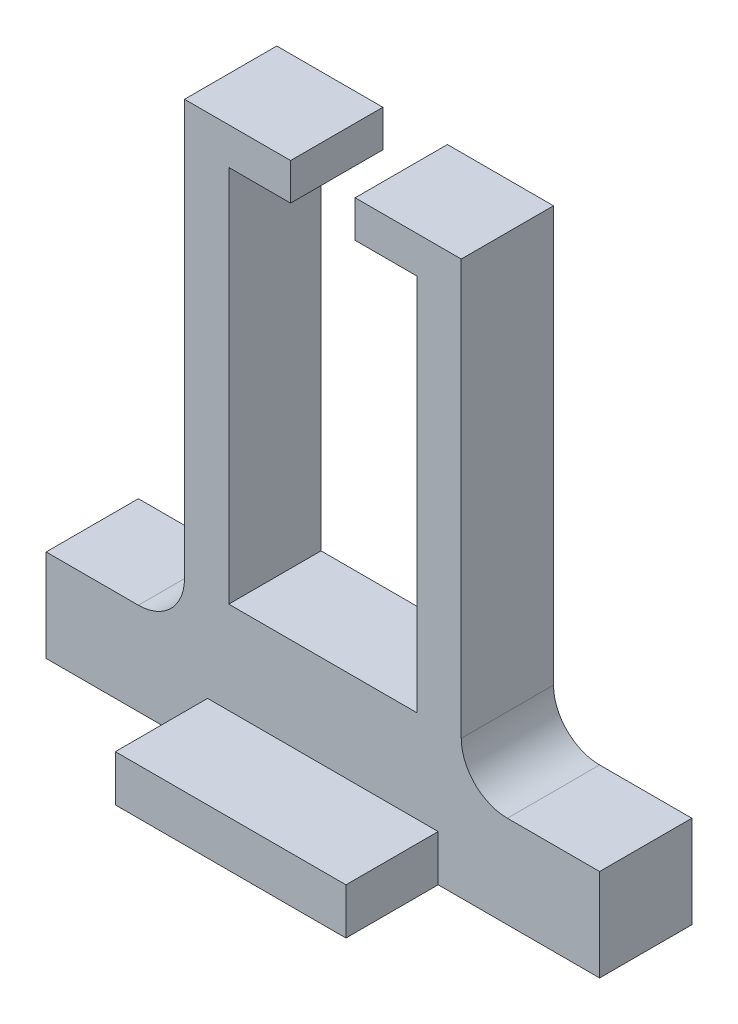
ISO-10303-21;
HEADER;
FILE_DESCRIPTION(('STEP AP214'),'2;1');
FILE_NAME('part.step','',(''),(''),'','','');
FILE_SCHEMA(('AUTOMOTIVE_DESIGN { 1 0 10303 214 1 1 1 1 }'));
ENDSEC;
DATA;
#1=APPLICATION_CONTEXT('core data for automotive mechanical design processes');
#2=APPLICATION_PROTOCOL_DEFINITION('international standard','automotive_design',2000,#1);
#3=PRODUCT_CONTEXT('',#1,'mechanical');
#4=PRODUCT('Part','Part','',(#3));
#5=PRODUCT_RELATED_PRODUCT_CATEGORY('part','',(#4));
#6=PRODUCT_DEFINITION_FORMATION('','',#4);
#7=PRODUCT_DEFINITION_CONTEXT('part definition',#1,'design');
#8=PRODUCT_DEFINITION('design','',#6,#7);
#9=PRODUCT_DEFINITION_SHAPE('','',#8);
#10=(LENGTH_UNIT() NAMED_UNIT(*) SI_UNIT(.MILLI.,.METRE.));
#11=(NAMED_UNIT(*) PLANE_ANGLE_UNIT() SI_UNIT($,.RADIAN.));
#12=(NAMED_UNIT(*) SI_UNIT($,.STERADIAN.) SOLID_ANGLE_UNIT());
#13=UNCERTAINTY_MEASURE_WITH_UNIT(LENGTH_MEASURE(1.E-05),#10,'distance_accuracy_value','');
#14=(GEOMETRIC_REPRESENTATION_CONTEXT(3) GLOBAL_UNCERTAINTY_ASSIGNED_CONTEXT((#13)) GLOBAL_UNIT_ASSIGNED_CONTEXT((#10,
#11,#12)) REPRESENTATION_CONTEXT('',''));
#15=CARTESIAN_POINT('',(0.,0.,0.));
#16=DIRECTION('',(0.,0.,1.));
#17=DIRECTION('',(1.,0.,0.));
#18=AXIS2_PLACEMENT_3D('',#15,#16,#17);
#19=CARTESIAN_POINT('',(20.,-20.5,10.));
#20=DIRECTION('',(0.,0.,-1.));
#21=DIRECTION('',(-1.,0.,0.));
#22=AXIS2_PLACEMENT_3D('',#19,#20,#21);
#23=PLANE('',#22);
#24=DIRECTION('',(0.,-1.,0.));
#25=VECTOR('',#24,1.);
#26=CARTESIAN_POINT('',(-12.5,-35.5,10.));
#27=LINE('',#26,#25);
#28=CARTESIAN_POINT('',(-12.5,-30.5,10.));
#29=VERTEX_POINT('',#28);
#30=CARTESIAN_POINT('',(-12.5,-35.5,10.));
#31=VERTEX_POINT('',#30);
#32=EDGE_CURVE('E52',#29,#31,#27,.T.);
#33=ORIENTED_EDGE('',*,*,#32,.F.);
#34=DIRECTION('',(-1.,0.,0.));
#35=VECTOR('',#34,1.);
#36=CARTESIAN_POINT('',(-12.5,-30.5,10.));
#37=LINE('',#36,#35);
#38=CARTESIAN_POINT('',(12.5,-30.5,10.));
#39=VERTEX_POINT('',#38);
#40=EDGE_CURVE('E205',#39,#29,#37,.T.);
#41=ORIENTED_EDGE('',*,*,#40,.F.);
#42=DIRECTION('',(0.,1.,0.));
#43=VECTOR('',#42,1.);
#44=CARTESIAN_POINT('',(12.5,-35.5,10.));
#45=LINE('',#44,#43);
#46=CARTESIAN_POINT('',(12.5,-35.5,10.));
#47=VERTEX_POINT('',#46);
#48=EDGE_CURVE('E58',#47,#39,#45,.T.);
#49=ORIENTED_EDGE('',*,*,#48,.F.);
#50=DIRECTION('',(1.,0.,0.));
#51=VECTOR('',#50,1.);
#52=CARTESIAN_POINT('',(30.,-35.5,10.));
#53=LINE('',#52,#51);
#54=CARTESIAN_POINT('',(30.,-35.5,10.));
#55=VERTEX_POINT('',#54);
#56=EDGE_CURVE('E281',#47,#55,#53,.T.);
#57=ORIENTED_EDGE('',*,*,#56,.T.);
#58=DIRECTION('',(0.,1.,0.));
#59=VECTOR('',#58,1.);
#60=CARTESIAN_POINT('',(30.,-25.5,10.));
#61=LINE('',#60,#59);
#62=CARTESIAN_POINT('',(30.,-25.5,10.));
#63=VERTEX_POINT('',#62);
#64=EDGE_CURVE('E284',#55,#63,#61,.T.);
#65=ORIENTED_EDGE('',*,*,#64,.T.);
#66=DIRECTION('',(-1.,0.,0.));
#67=VECTOR('',#66,1.);
#68=CARTESIAN_POINT('',(20.,-25.5,10.));
#69=LINE('',#68,#67);
#70=CARTESIAN_POINT('',(20.,-25.5,10.));
#71=VERTEX_POINT('',#70);
#72=EDGE_CURVE('E286',#63,#71,#69,.T.);
#73=ORIENTED_EDGE('',*,*,#72,.T.);
#74=CARTESIAN_POINT('',(20.,-20.5,10.));
#75=DIRECTION('',(0.,0.,-1.));
#76=DIRECTION('',(-1.,0.,0.));
#77=AXIS2_PLACEMENT_3D('',#74,#75,#76);
#78=CIRCLE('',#77,5.);
#79=CARTESIAN_POINT('',(15.,-20.5,10.));
#80=VERTEX_POINT('',#79);
#81=EDGE_CURVE('E288',#71,#80,#78,.T.);
#82=ORIENTED_EDGE('',*,*,#81,.T.);
#83=DIRECTION('',(0.,1.,0.));
#84=VECTOR('',#83,1.);
#85=CARTESIAN_POINT('',(15.,24.5,10.));
#86=LINE('',#85,#84);
#87=CARTESIAN_POINT('',(15.,24.5,10.));
#88=VERTEX_POINT('',#87);
#89=EDGE_CURVE('E290',#80,#88,#86,.T.);
#90=ORIENTED_EDGE('',*,*,#89,.T.);
#91=DIRECTION('',(-1.,0.,0.));
#92=VECTOR('',#91,1.);
#93=CARTESIAN_POINT('',(-15.,24.5,10.));
#94=LINE('',#93,#92);
#95=CARTESIAN_POINT('',(3.5,24.5,10.));
#96=VERTEX_POINT('',#95);
#97=EDGE_CURVE('E269',#88,#96,#94,.T.);
#98=ORIENTED_EDGE('',*,*,#97,.T.);
#99=DIRECTION('',(0.,1.,0.));
#100=VECTOR('',#99,1.);
#101=CARTESIAN_POINT('',(3.5,-35.501,10.));
#102=LINE('',#101,#100);
#103=CARTESIAN_POINT('',(3.5,20.5,10.));
#104=VERTEX_POINT('',#103);
#105=EDGE_CURVE('E220',#104,#96,#102,.T.);
#106=ORIENTED_EDGE('',*,*,#105,.F.);
#107=DIRECTION('',(-1.,0.,0.));
#108=VECTOR('',#107,1.);
#109=CARTESIAN_POINT('',(-10.2,20.5,10.));
#110=LINE('',#109,#108);
#111=CARTESIAN_POINT('',(10.2,20.5,10.));
#112=VERTEX_POINT('',#111);
#113=EDGE_CURVE('E238',#112,#104,#110,.T.);
#114=ORIENTED_EDGE('',*,*,#113,.F.);
#115=DIRECTION('',(0.,1.,0.));
#116=VECTOR('',#115,1.);
#117=CARTESIAN_POINT('',(10.2,20.5,10.));
#118=LINE('',#117,#116);
#119=CARTESIAN_POINT('',(10.2,-20.5,10.));
#120=VERTEX_POINT('',#119);
#121=EDGE_CURVE('E234',#120,#112,#118,.T.);
#122=ORIENTED_EDGE('',*,*,#121,.F.);
#123=DIRECTION('',(1.,0.,0.));
#124=VECTOR('',#123,1.);
#125=CARTESIAN_POINT('',(-10.2,-20.5,10.));
#126=LINE('',#125,#124);
#127=CARTESIAN_POINT('',(-10.2,-20.5,10.));
#128=VERTEX_POINT('',#127);
#129=EDGE_CURVE('E244',#128,#120,#126,.T.);
#130=ORIENTED_EDGE('',*,*,#129,.F.);
#131=DIRECTION('',(0.,-1.,0.));
#132=VECTOR('',#131,1.);
#133=CARTESIAN_POINT('',(-10.2,20.5,10.));
#134=LINE('',#133,#132);
#135=CARTESIAN_POINT('',(-10.2,20.5,10.));
#136=VERTEX_POINT('',#135);
#137=EDGE_CURVE('E241',#136,#128,#134,.T.);
#138=ORIENTED_EDGE('',*,*,#137,.F.);
#139=CARTESIAN_POINT('',(-3.5,20.5,10.));
#140=VERTEX_POINT('',#139);
#141=EDGE_CURVE('E236',#140,#136,#110,.T.);
#142=ORIENTED_EDGE('',*,*,#141,.F.);
#143=DIRECTION('',(0.,1.,0.));
#144=VECTOR('',#143,1.);
#145=CARTESIAN_POINT('',(-3.5,-35.501,10.));
#146=LINE('',#145,#144);
#147=CARTESIAN_POINT('',(-3.5,24.5,10.));
#148=VERTEX_POINT('',#147);
#149=EDGE_CURVE('E219',#140,#148,#146,.T.);
#150=ORIENTED_EDGE('',*,*,#149,.T.);
#151=CARTESIAN_POINT('',(-15.,24.5,10.));
#152=VERTEX_POINT('',#151);
#153=EDGE_CURVE('E273',#148,#152,#94,.T.);
#154=ORIENTED_EDGE('',*,*,#153,.T.);
#155=DIRECTION('',(0.,-1.,0.));
#156=VECTOR('',#155,1.);
#157=CARTESIAN_POINT('',(-15.,24.5,10.));
#158=LINE('',#157,#156);
#159=CARTESIAN_POINT('',(-15.,-20.5,10.));
#160=VERTEX_POINT('',#159);
#161=EDGE_CURVE('E272',#152,#160,#158,.T.);
#162=ORIENTED_EDGE('',*,*,#161,.T.);
#163=CARTESIAN_POINT('',(-20.,-20.5,10.));
#164=DIRECTION('',(0.,0.,-1.));
#165=DIRECTION('',(-1.,0.,0.));
#166=AXIS2_PLACEMENT_3D('',#163,#164,#165);
#167=CIRCLE('',#166,5.);
#168=CARTESIAN_POINT('',(-20.,-25.5,10.));
#169=VERTEX_POINT('',#168);
#170=EDGE_CURVE('E275',#160,#169,#167,.T.);
#171=ORIENTED_EDGE('',*,*,#170,.T.);
#172=DIRECTION('',(-1.,0.,0.));
#173=VECTOR('',#172,1.);
#174=CARTESIAN_POINT('',(-30.,-25.5,10.));
#175=LINE('',#174,#173);
#176=CARTESIAN_POINT('',(-30.,-25.5,10.));
#177=VERTEX_POINT('',#176);
#178=EDGE_CURVE('E277',#169,#177,#175,.T.);
#179=ORIENTED_EDGE('',*,*,#178,.T.);
#180=DIRECTION('',(0.,-1.,0.));
#181=VECTOR('',#180,1.);
#182=CARTESIAN_POINT('',(-30.,-35.5,10.));
#183=LINE('',#182,#181);
#184=CARTESIAN_POINT('',(-30.,-35.5,10.));
#185=VERTEX_POINT('',#184);
#186=EDGE_CURVE('E279',#177,#185,#183,.T.);
#187=ORIENTED_EDGE('',*,*,#186,.T.);
#188=EDGE_CURVE('E282',#185,#31,#53,.T.);
#189=ORIENTED_EDGE('',*,*,#188,.T.);
#190=EDGE_LOOP('',(#33,#41,#49,#57,#65,#73,#82,#90,#98,#106,#114,#122,#130,#138,#142,#150,#154,
#162,#171,#179,#187,#189));
#191=FACE_BOUND('',#190,.T.);
#192=ADVANCED_FACE('F37',(#191),#23,.F.);
#193=CARTESIAN_POINT('',(-15.,24.5,10.));
#194=DIRECTION('',(0.,-1.,0.));
#195=DIRECTION('',(0.,0.,-1.));
#196=AXIS2_PLACEMENT_3D('',#193,#194,#195);
#197=PLANE('',#196);
#198=DIRECTION('',(-1.,0.,0.));
#199=VECTOR('',#198,1.);
#200=CARTESIAN_POINT('',(-15.,24.5,0.));
#201=LINE('',#200,#199);
#202=CARTESIAN_POINT('',(15.,24.5,0.));
#203=VERTEX_POINT('',#202);
#204=CARTESIAN_POINT('',(3.5,24.5,0.));
#205=VERTEX_POINT('',#204);
#206=EDGE_CURVE('E293',#203,#205,#201,.T.);
#207=ORIENTED_EDGE('',*,*,#206,.T.);
#208=DIRECTION('',(0.,0.,-1.));
#209=VECTOR('',#208,1.);
#210=CARTESIAN_POINT('',(3.5,24.5,10.));
#211=LINE('',#210,#209);
#212=EDGE_CURVE('E221',#96,#205,#211,.T.);
#213=ORIENTED_EDGE('',*,*,#212,.F.);
#214=ORIENTED_EDGE('',*,*,#97,.F.);
#215=DIRECTION('',(0.,0.,-1.));
#216=VECTOR('',#215,1.);
#217=CARTESIAN_POINT('',(15.,24.5,10.));
#218=LINE('',#217,#216);
#219=EDGE_CURVE('E292',#88,#203,#218,.T.);
#220=ORIENTED_EDGE('',*,*,#219,.T.);
#221=EDGE_LOOP('',(#207,#213,#214,#220));
#222=FACE_BOUND('',#221,.T.);
#223=ADVANCED_FACE('F394',(#222),#197,.F.);
#224=CARTESIAN_POINT('',(-10.2,20.5,10.));
#225=DIRECTION('',(0.,-1.,0.));
#226=DIRECTION('',(0.,0.,-1.));
#227=AXIS2_PLACEMENT_3D('',#224,#225,#226);
#228=PLANE('',#227);
#229=DIRECTION('',(0.,0.,-1.));
#230=VECTOR('',#229,1.);
#231=CARTESIAN_POINT('',(3.5,20.5,10.));
#232=LINE('',#231,#230);
#233=CARTESIAN_POINT('',(3.5,20.5,0.));
#234=VERTEX_POINT('',#233);
#235=EDGE_CURVE('E210',#104,#234,#232,.T.);
#236=ORIENTED_EDGE('',*,*,#235,.T.);
#237=DIRECTION('',(-1.,0.,0.));
#238=VECTOR('',#237,1.);
#239=CARTESIAN_POINT('',(-10.2,20.5,0.));
#240=LINE('',#239,#238);
#241=CARTESIAN_POINT('',(10.2,20.5,0.));
#242=VERTEX_POINT('',#241);
#243=EDGE_CURVE('E250',#242,#234,#240,.T.);
#244=ORIENTED_EDGE('',*,*,#243,.F.);
#245=DIRECTION('',(0.,0.,-1.));
#246=VECTOR('',#245,1.);
#247=CARTESIAN_POINT('',(10.2,20.5,10.));
#248=LINE('',#247,#246);
#249=EDGE_CURVE('E265',#112,#242,#248,.T.);
#250=ORIENTED_EDGE('',*,*,#249,.F.);
#251=ORIENTED_EDGE('',*,*,#113,.T.);
#252=EDGE_LOOP('',(#236,#244,#250,#251));
#253=FACE_BOUND('',#252,.T.);
#254=ADVANCED_FACE('F388',(#253),#228,.T.);
#255=CARTESIAN_POINT('',(20.,-20.5,0.));
#256=DIRECTION('',(0.,0.,-1.));
#257=DIRECTION('',(-1.,0.,0.));
#258=AXIS2_PLACEMENT_3D('',#255,#256,#257);
#259=PLANE('',#258);
#260=DIRECTION('',(0.,1.,0.));
#261=VECTOR('',#260,1.);
#262=CARTESIAN_POINT('',(3.5,-35.501,0.));
#263=LINE('',#262,#261);
#264=EDGE_CURVE('E228',#234,#205,#263,.T.);
#265=ORIENTED_EDGE('',*,*,#264,.T.);
#266=ORIENTED_EDGE('',*,*,#206,.F.);
#267=DIRECTION('',(0.,1.,0.));
#268=VECTOR('',#267,1.);
#269=CARTESIAN_POINT('',(15.,24.5,0.));
#270=LINE('',#269,#268);
#271=CARTESIAN_POINT('',(15.,-20.5,0.));
#272=VERTEX_POINT('',#271);
#273=EDGE_CURVE('E312',#272,#203,#270,.T.);
#274=ORIENTED_EDGE('',*,*,#273,.F.);
#275=CARTESIAN_POINT('',(20.,-20.5,0.));
#276=DIRECTION('',(0.,0.,-1.));
#277=DIRECTION('',(-1.,0.,0.));
#278=AXIS2_PLACEMENT_3D('',#275,#276,#277);
#279=CIRCLE('',#278,5.);
#280=CARTESIAN_POINT('',(20.,-25.5,0.));
#281=VERTEX_POINT('',#280);
#282=EDGE_CURVE('E310',#281,#272,#279,.T.);
#283=ORIENTED_EDGE('',*,*,#282,.F.);
#284=DIRECTION('',(-1.,0.,0.));
#285=VECTOR('',#284,1.);
#286=CARTESIAN_POINT('',(20.,-25.5,0.));
#287=LINE('',#286,#285);
#288=CARTESIAN_POINT('',(30.,-25.5,0.));
#289=VERTEX_POINT('',#288);
#290=EDGE_CURVE('E308',#289,#281,#287,.T.);
#291=ORIENTED_EDGE('',*,*,#290,.F.);
#292=DIRECTION('',(0.,1.,0.));
#293=VECTOR('',#292,1.);
#294=CARTESIAN_POINT('',(30.,-25.5,0.));
#295=LINE('',#294,#293);
#296=CARTESIAN_POINT('',(30.,-35.5,0.));
#297=VERTEX_POINT('',#296);
#298=EDGE_CURVE('E306',#297,#289,#295,.T.);
#299=ORIENTED_EDGE('',*,*,#298,.F.);
#300=DIRECTION('',(1.,0.,0.));
#301=VECTOR('',#300,1.);
#302=CARTESIAN_POINT('',(30.,-35.5,0.));
#303=LINE('',#302,#301);
#304=CARTESIAN_POINT('',(-30.,-35.5,0.));
#305=VERTEX_POINT('',#304);
#306=EDGE_CURVE('E304',#305,#297,#303,.T.);
#307=ORIENTED_EDGE('',*,*,#306,.F.);
#308=DIRECTION('',(0.,-1.,0.));
#309=VECTOR('',#308,1.);
#310=CARTESIAN_POINT('',(-30.,-35.5,0.));
#311=LINE('',#310,#309);
#312=CARTESIAN_POINT('',(-30.,-25.5,0.));
#313=VERTEX_POINT('',#312);
#314=EDGE_CURVE('E302',#313,#305,#311,.T.);
#315=ORIENTED_EDGE('',*,*,#314,.F.);
#316=DIRECTION('',(-1.,0.,0.));
#317=VECTOR('',#316,1.);
#318=CARTESIAN_POINT('',(-30.,-25.5,0.));
#319=LINE('',#318,#317);
#320=CARTESIAN_POINT('',(-20.,-25.5,0.));
#321=VERTEX_POINT('',#320);
#322=EDGE_CURVE('E300',#321,#313,#319,.T.);
#323=ORIENTED_EDGE('',*,*,#322,.F.);
#324=CARTESIAN_POINT('',(-20.,-20.5,0.));
#325=DIRECTION('',(0.,0.,-1.));
#326=DIRECTION('',(-1.,0.,0.));
#327=AXIS2_PLACEMENT_3D('',#324,#325,#326);
#328=CIRCLE('',#327,5.);
#329=CARTESIAN_POINT('',(-15.,-20.5,0.));
#330=VERTEX_POINT('',#329);
#331=EDGE_CURVE('E298',#330,#321,#328,.T.);
#332=ORIENTED_EDGE('',*,*,#331,.F.);
#333=DIRECTION('',(0.,-1.,0.));
#334=VECTOR('',#333,1.);
#335=CARTESIAN_POINT('',(-15.,24.5,0.));
#336=LINE('',#335,#334);
#337=CARTESIAN_POINT('',(-15.,24.5,0.));
#338=VERTEX_POINT('',#337);
#339=EDGE_CURVE('E296',#338,#330,#336,.T.);
#340=ORIENTED_EDGE('',*,*,#339,.F.);
#341=CARTESIAN_POINT('',(-3.5,24.5,0.));
#342=VERTEX_POINT('',#341);
#343=EDGE_CURVE('E268',#342,#338,#201,.T.);
#344=ORIENTED_EDGE('',*,*,#343,.F.);
#345=DIRECTION('',(0.,1.,0.));
#346=VECTOR('',#345,1.);
#347=CARTESIAN_POINT('',(-3.5,-35.501,0.));
#348=LINE('',#347,#346);
#349=CARTESIAN_POINT('',(-3.5,20.5,0.));
#350=VERTEX_POINT('',#349);
#351=EDGE_CURVE('E208',#350,#342,#348,.T.);
#352=ORIENTED_EDGE('',*,*,#351,.F.);
#353=CARTESIAN_POINT('',(-10.2,20.5,0.));
#354=VERTEX_POINT('',#353);
#355=EDGE_CURVE('E249',#350,#354,#240,.T.);
#356=ORIENTED_EDGE('',*,*,#355,.T.);
#357=DIRECTION('',(0.,-1.,0.));
#358=VECTOR('',#357,1.);
#359=CARTESIAN_POINT('',(-10.2,20.5,0.));
#360=LINE('',#359,#358);
#361=CARTESIAN_POINT('',(-10.2,-20.5,0.));
#362=VERTEX_POINT('',#361);
#363=EDGE_CURVE('E253',#354,#362,#360,.T.);
#364=ORIENTED_EDGE('',*,*,#363,.T.);
#365=DIRECTION('',(1.,0.,0.));
#366=VECTOR('',#365,1.);
#367=CARTESIAN_POINT('',(-10.2,-20.5,0.));
#368=LINE('',#367,#366);
#369=CARTESIAN_POINT('',(10.2,-20.5,0.));
#370=VERTEX_POINT('',#369);
#371=EDGE_CURVE('E237',#362,#370,#368,.T.);
#372=ORIENTED_EDGE('',*,*,#371,.T.);
#373=DIRECTION('',(0.,1.,0.));
#374=VECTOR('',#373,1.);
#375=CARTESIAN_POINT('',(10.2,20.5,0.));
#376=LINE('',#375,#374);
#377=EDGE_CURVE('E223',#370,#242,#376,.T.);
#378=ORIENTED_EDGE('',*,*,#377,.T.);
#379=ORIENTED_EDGE('',*,*,#243,.T.);
#380=EDGE_LOOP('',(#265,#266,#274,#283,#291,#299,#307,#315,#323,#332,#340,#344,#352,#356,#364,
#372,#378,#379));
#381=FACE_BOUND('',#380,.T.);
#382=ADVANCED_FACE('F348',(#381),#259,.T.);
#383=ORIENTED_EDGE('',*,*,#153,.F.);
#384=DIRECTION('',(0.,0.,1.));
#385=VECTOR('',#384,1.);
#386=CARTESIAN_POINT('',(-3.5,24.5,0.));
#387=LINE('',#386,#385);
#388=EDGE_CURVE('E224',#342,#148,#387,.T.);
#389=ORIENTED_EDGE('',*,*,#388,.F.);
#390=ORIENTED_EDGE('',*,*,#343,.T.);
#391=DIRECTION('',(0.,0.,-1.));
#392=VECTOR('',#391,1.);
#393=CARTESIAN_POINT('',(-15.,24.5,10.));
#394=LINE('',#393,#392);
#395=EDGE_CURVE('E11',#152,#338,#394,.T.);
#396=ORIENTED_EDGE('',*,*,#395,.F.);
#397=EDGE_LOOP('',(#383,#389,#390,#396));
#398=FACE_BOUND('',#397,.T.);
#399=ADVANCED_FACE('F39',(#398),#197,.F.);
#400=CARTESIAN_POINT('',(-15.,24.5,10.));
#401=DIRECTION('',(1.,0.,0.));
#402=DIRECTION('',(0.,1.,0.));
#403=AXIS2_PLACEMENT_3D('',#400,#401,#402);
#404=PLANE('',#403);
#405=ORIENTED_EDGE('',*,*,#339,.T.);
#406=DIRECTION('',(0.,0.,-1.));
#407=VECTOR('',#406,1.);
#408=CARTESIAN_POINT('',(-15.,-20.5,10.));
#409=LINE('',#408,#407);
#410=EDGE_CURVE('E45',#160,#330,#409,.T.);
#411=ORIENTED_EDGE('',*,*,#410,.F.);
#412=ORIENTED_EDGE('',*,*,#161,.F.);
#413=ORIENTED_EDGE('',*,*,#395,.T.);
#414=EDGE_LOOP('',(#405,#411,#412,#413));
#415=FACE_BOUND('',#414,.T.);
#416=ADVANCED_FACE('F362',(#415),#404,.F.);
#417=CARTESIAN_POINT('',(-20.,-20.5,10.));
#418=DIRECTION('',(0.,0.,-1.));
#419=DIRECTION('',(-1.,0.,0.));
#420=AXIS2_PLACEMENT_3D('',#417,#418,#419);
#421=CYLINDRICAL_SURFACE('',#420,5.);
#422=ORIENTED_EDGE('',*,*,#331,.T.);
#423=DIRECTION('',(0.,0.,-1.));
#424=VECTOR('',#423,1.);
#425=CARTESIAN_POINT('',(-20.,-25.5,10.));
#426=LINE('',#425,#424);
#427=EDGE_CURVE('E334',#169,#321,#426,.T.);
#428=ORIENTED_EDGE('',*,*,#427,.F.);
#429=ORIENTED_EDGE('',*,*,#170,.F.);
#430=ORIENTED_EDGE('',*,*,#410,.T.);
#431=EDGE_LOOP('',(#422,#428,#429,#430));
#432=FACE_BOUND('',#431,.T.);
#433=ADVANCED_FACE('F341',(#432),#421,.F.);
#434=CARTESIAN_POINT('',(-30.,-25.5,10.));
#435=DIRECTION('',(0.,-1.,0.));
#436=DIRECTION('',(1.,0.,0.));
#437=AXIS2_PLACEMENT_3D('',#434,#435,#436);
#438=PLANE('',#437);
#439=ORIENTED_EDGE('',*,*,#322,.T.);
#440=DIRECTION('',(0.,0.,-1.));
#441=VECTOR('',#440,1.);
#442=CARTESIAN_POINT('',(-30.,-25.5,10.));
#443=LINE('',#442,#441);
#444=EDGE_CURVE('E331',#177,#313,#443,.T.);
#445=ORIENTED_EDGE('',*,*,#444,.F.);
#446=ORIENTED_EDGE('',*,*,#178,.F.);
#447=ORIENTED_EDGE('',*,*,#427,.T.);
#448=EDGE_LOOP('',(#439,#445,#446,#447));
#449=FACE_BOUND('',#448,.T.);
#450=ADVANCED_FACE('F354',(#449),#438,.F.);
#451=CARTESIAN_POINT('',(-30.,-35.5,10.));
#452=DIRECTION('',(1.,0.,0.));
#453=DIRECTION('',(0.,1.,0.));
#454=AXIS2_PLACEMENT_3D('',#451,#452,#453);
#455=PLANE('',#454);
#456=ORIENTED_EDGE('',*,*,#314,.T.);
#457=DIRECTION('',(0.,0.,-1.));
#458=VECTOR('',#457,1.);
#459=CARTESIAN_POINT('',(-30.,-35.5,10.));
#460=LINE('',#459,#458);
#461=EDGE_CURVE('E328',#185,#305,#460,.T.);
#462=ORIENTED_EDGE('',*,*,#461,.F.);
#463=ORIENTED_EDGE('',*,*,#186,.F.);
#464=ORIENTED_EDGE('',*,*,#444,.T.);
#465=EDGE_LOOP('',(#456,#462,#463,#464));
#466=FACE_BOUND('',#465,.T.);
#467=ADVANCED_FACE('F358',(#466),#455,.F.);
#468=CARTESIAN_POINT('',(30.,-35.5,10.));
#469=DIRECTION('',(0.,1.,0.));
#470=DIRECTION('',(0.,0.,1.));
#471=AXIS2_PLACEMENT_3D('',#468,#469,#470);
#472=PLANE('',#471);
#473=ORIENTED_EDGE('',*,*,#306,.T.);
#474=DIRECTION('',(0.,0.,-1.));
#475=VECTOR('',#474,1.);
#476=CARTESIAN_POINT('',(30.,-35.5,10.));
#477=LINE('',#476,#475);
#478=EDGE_CURVE('E325',#55,#297,#477,.T.);
#479=ORIENTED_EDGE('',*,*,#478,.F.);
#480=ORIENTED_EDGE('',*,*,#56,.F.);
#481=DIRECTION('',(0.,0.,-1.));
#482=VECTOR('',#481,1.);
#483=CARTESIAN_POINT('',(12.5,-35.5,20.));
#484=LINE('',#483,#482);
#485=CARTESIAN_POINT('',(12.5,-35.5,20.));
#486=VERTEX_POINT('',#485);
#487=EDGE_CURVE('E192',#486,#47,#484,.T.);
#488=ORIENTED_EDGE('',*,*,#487,.F.);
#489=DIRECTION('',(1.,0.,0.));
#490=VECTOR('',#489,1.);
#491=CARTESIAN_POINT('',(-12.5,-35.5,20.));
#492=LINE('',#491,#490);
#493=CARTESIAN_POINT('',(-12.5,-35.5,20.));
#494=VERTEX_POINT('',#493);
#495=EDGE_CURVE('E185',#494,#486,#492,.T.);
#496=ORIENTED_EDGE('',*,*,#495,.F.);
#497=DIRECTION('',(0.,0.,-1.));
#498=VECTOR('',#497,1.);
#499=CARTESIAN_POINT('',(-12.5,-35.5,20.));
#500=LINE('',#499,#498);
#501=EDGE_CURVE('E190',#494,#31,#500,.T.);
#502=ORIENTED_EDGE('',*,*,#501,.T.);
#503=ORIENTED_EDGE('',*,*,#188,.F.);
#504=ORIENTED_EDGE('',*,*,#461,.T.);
#505=EDGE_LOOP('',(#473,#479,#480,#488,#496,#502,#503,#504));
#506=FACE_BOUND('',#505,.T.);
#507=ADVANCED_FACE('F187',(#506),#472,.F.);
#508=CARTESIAN_POINT('',(30.,-25.5,10.));
#509=DIRECTION('',(-1.,0.,0.));
#510=DIRECTION('',(0.,-1.,0.));
#511=AXIS2_PLACEMENT_3D('',#508,#509,#510);
#512=PLANE('',#511);
#513=ORIENTED_EDGE('',*,*,#298,.T.);
#514=DIRECTION('',(0.,0.,-1.));
#515=VECTOR('',#514,1.);
#516=CARTESIAN_POINT('',(30.,-25.5,10.));
#517=LINE('',#516,#515);
#518=EDGE_CURVE('E322',#63,#289,#517,.T.);
#519=ORIENTED_EDGE('',*,*,#518,.F.);
#520=ORIENTED_EDGE('',*,*,#64,.F.);
#521=ORIENTED_EDGE('',*,*,#478,.T.);
#522=EDGE_LOOP('',(#513,#519,#520,#521));
#523=FACE_BOUND('',#522,.T.);
#524=ADVANCED_FACE('F414',(#523),#512,.F.);
#525=CARTESIAN_POINT('',(20.,-25.5,10.));
#526=DIRECTION('',(0.,-1.,0.));
#527=DIRECTION('',(1.,0.,0.));
#528=AXIS2_PLACEMENT_3D('',#525,#526,#527);
#529=PLANE('',#528);
#530=ORIENTED_EDGE('',*,*,#290,.T.);
#531=DIRECTION('',(0.,0.,-1.));
#532=VECTOR('',#531,1.);
#533=CARTESIAN_POINT('',(20.,-25.5,10.));
#534=LINE('',#533,#532);
#535=EDGE_CURVE('E319',#71,#281,#534,.T.);
#536=ORIENTED_EDGE('',*,*,#535,.F.);
#537=ORIENTED_EDGE('',*,*,#72,.F.);
#538=ORIENTED_EDGE('',*,*,#518,.T.);
#539=EDGE_LOOP('',(#530,#536,#537,#538));
#540=FACE_BOUND('',#539,.T.);
#541=ADVANCED_FACE('F410',(#540),#529,.F.);
#542=CARTESIAN_POINT('',(20.,-20.5,10.));
#543=DIRECTION('',(0.,0.,-1.));
#544=DIRECTION('',(-1.,0.,0.));
#545=AXIS2_PLACEMENT_3D('',#542,#543,#544);
#546=CYLINDRICAL_SURFACE('',#545,5.);
#547=ORIENTED_EDGE('',*,*,#282,.T.);
#548=DIRECTION('',(0.,0.,-1.));
#549=VECTOR('',#548,1.);
#550=CARTESIAN_POINT('',(15.,-20.5,10.));
#551=LINE('',#550,#549);
#552=EDGE_CURVE('E316',#80,#272,#551,.T.);
#553=ORIENTED_EDGE('',*,*,#552,.F.);
#554=ORIENTED_EDGE('',*,*,#81,.F.);
#555=ORIENTED_EDGE('',*,*,#535,.T.);
#556=EDGE_LOOP('',(#547,#553,#554,#555));
#557=FACE_BOUND('',#556,.T.);
#558=ADVANCED_FACE('F405',(#557),#546,.F.);
#559=CARTESIAN_POINT('',(15.,24.5,10.));
#560=DIRECTION('',(-1.,0.,0.));
#561=DIRECTION('',(0.,-1.,0.));
#562=AXIS2_PLACEMENT_3D('',#559,#560,#561);
#563=PLANE('',#562);
#564=ORIENTED_EDGE('',*,*,#273,.T.);
#565=ORIENTED_EDGE('',*,*,#219,.F.);
#566=ORIENTED_EDGE('',*,*,#89,.F.);
#567=ORIENTED_EDGE('',*,*,#552,.T.);
#568=EDGE_LOOP('',(#564,#565,#566,#567));
#569=FACE_BOUND('',#568,.T.);
#570=ADVANCED_FACE('F399',(#569),#563,.F.);
#571=CARTESIAN_POINT('',(10.2,20.5,10.));
#572=DIRECTION('',(-1.,0.,0.));
#573=DIRECTION('',(0.,-1.,0.));
#574=AXIS2_PLACEMENT_3D('',#571,#572,#573);
#575=PLANE('',#574);
#576=ORIENTED_EDGE('',*,*,#377,.F.);
#577=DIRECTION('',(0.,0.,-1.));
#578=VECTOR('',#577,1.);
#579=CARTESIAN_POINT('',(10.2,-20.5,10.));
#580=LINE('',#579,#578);
#581=EDGE_CURVE('E246',#120,#370,#580,.T.);
#582=ORIENTED_EDGE('',*,*,#581,.F.);
#583=ORIENTED_EDGE('',*,*,#121,.T.);
#584=ORIENTED_EDGE('',*,*,#249,.T.);
#585=EDGE_LOOP('',(#576,#582,#583,#584));
#586=FACE_BOUND('',#585,.T.);
#587=ADVANCED_FACE('F383',(#586),#575,.T.);
#588=DIRECTION('',(0.,0.,1.));
#589=VECTOR('',#588,1.);
#590=CARTESIAN_POINT('',(-3.5,20.5,0.));
#591=LINE('',#590,#589);
#592=EDGE_CURVE('E216',#350,#140,#591,.T.);
#593=ORIENTED_EDGE('',*,*,#592,.T.);
#594=ORIENTED_EDGE('',*,*,#141,.T.);
#595=DIRECTION('',(0.,0.,-1.));
#596=VECTOR('',#595,1.);
#597=CARTESIAN_POINT('',(-10.2,20.5,10.));
#598=LINE('',#597,#596);
#599=EDGE_CURVE('E262',#136,#354,#598,.T.);
#600=ORIENTED_EDGE('',*,*,#599,.T.);
#601=ORIENTED_EDGE('',*,*,#355,.F.);
#602=EDGE_LOOP('',(#593,#594,#600,#601));
#603=FACE_BOUND('',#602,.T.);
#604=ADVANCED_FACE('F369',(#603),#228,.T.);
#605=CARTESIAN_POINT('',(-10.2,20.5,10.));
#606=DIRECTION('',(1.,0.,0.));
#607=DIRECTION('',(0.,1.,0.));
#608=AXIS2_PLACEMENT_3D('',#605,#606,#607);
#609=PLANE('',#608);
#610=ORIENTED_EDGE('',*,*,#363,.F.);
#611=ORIENTED_EDGE('',*,*,#599,.F.);
#612=ORIENTED_EDGE('',*,*,#137,.T.);
#613=DIRECTION('',(0.,0.,-1.));
#614=VECTOR('',#613,1.);
#615=CARTESIAN_POINT('',(-10.2,-20.5,10.));
#616=LINE('',#615,#614);
#617=EDGE_CURVE('E260',#128,#362,#616,.T.);
#618=ORIENTED_EDGE('',*,*,#617,.T.);
#619=EDGE_LOOP('',(#610,#611,#612,#618));
#620=FACE_BOUND('',#619,.T.);
#621=ADVANCED_FACE('F375',(#620),#609,.T.);
#622=CARTESIAN_POINT('',(-10.2,-20.5,10.));
#623=DIRECTION('',(0.,1.,0.));
#624=DIRECTION('',(0.,0.,1.));
#625=AXIS2_PLACEMENT_3D('',#622,#623,#624);
#626=PLANE('',#625);
#627=ORIENTED_EDGE('',*,*,#371,.F.);
#628=ORIENTED_EDGE('',*,*,#617,.F.);
#629=ORIENTED_EDGE('',*,*,#129,.T.);
#630=ORIENTED_EDGE('',*,*,#581,.T.);
#631=EDGE_LOOP('',(#627,#628,#629,#630));
#632=FACE_BOUND('',#631,.T.);
#633=ADVANCED_FACE('F378',(#632),#626,.T.);
#634=CARTESIAN_POINT('',(-3.5,-35.501,0.));
#635=DIRECTION('',(-1.,0.,0.));
#636=DIRECTION('',(0.,0.,1.));
#637=AXIS2_PLACEMENT_3D('',#634,#635,#636);
#638=PLANE('',#637);
#639=ORIENTED_EDGE('',*,*,#351,.T.);
#640=ORIENTED_EDGE('',*,*,#388,.T.);
#641=ORIENTED_EDGE('',*,*,#149,.F.);
#642=ORIENTED_EDGE('',*,*,#592,.F.);
#643=EDGE_LOOP('',(#639,#640,#641,#642));
#644=FACE_BOUND('',#643,.T.);
#645=ADVANCED_FACE('F492',(#644),#638,.F.);
#646=CARTESIAN_POINT('',(3.5,-35.501,10.));
#647=DIRECTION('',(1.,0.,0.));
#648=DIRECTION('',(0.,0.,-1.));
#649=AXIS2_PLACEMENT_3D('',#646,#647,#648);
#650=PLANE('',#649);
#651=ORIENTED_EDGE('',*,*,#105,.T.);
#652=ORIENTED_EDGE('',*,*,#212,.T.);
#653=ORIENTED_EDGE('',*,*,#264,.F.);
#654=ORIENTED_EDGE('',*,*,#235,.F.);
#655=EDGE_LOOP('',(#651,#652,#653,#654));
#656=FACE_BOUND('',#655,.T.);
#657=ADVANCED_FACE('F579',(#656),#650,.F.);
#658=CARTESIAN_POINT('',(-12.5,-35.5,20.));
#659=DIRECTION('',(1.,0.,0.));
#660=DIRECTION('',(0.,1.,0.));
#661=AXIS2_PLACEMENT_3D('',#658,#659,#660);
#662=PLANE('',#661);
#663=ORIENTED_EDGE('',*,*,#32,.T.);
#664=ORIENTED_EDGE('',*,*,#501,.F.);
#665=DIRECTION('',(0.,-1.,0.));
#666=VECTOR('',#665,1.);
#667=CARTESIAN_POINT('',(-12.5,-35.5,20.));
#668=LINE('',#667,#666);
#669=CARTESIAN_POINT('',(-12.5,-30.5,20.));
#670=VERTEX_POINT('',#669);
#671=EDGE_CURVE('E196',#670,#494,#668,.T.);
#672=ORIENTED_EDGE('',*,*,#671,.F.);
#673=DIRECTION('',(0.,0.,-1.));
#674=VECTOR('',#673,1.);
#675=CARTESIAN_POINT('',(-12.5,-30.5,20.));
#676=LINE('',#675,#674);
#677=EDGE_CURVE('E421',#670,#29,#676,.T.);
#678=ORIENTED_EDGE('',*,*,#677,.T.);
#679=EDGE_LOOP('',(#663,#664,#672,#678));
#680=FACE_BOUND('',#679,.T.);
#681=ADVANCED_FACE('F207',(#680),#662,.F.);
#682=CARTESIAN_POINT('',(12.5,-35.5,20.));
#683=DIRECTION('',(-1.,0.,0.));
#684=DIRECTION('',(0.,0.,1.));
#685=AXIS2_PLACEMENT_3D('',#682,#683,#684);
#686=PLANE('',#685);
#687=ORIENTED_EDGE('',*,*,#48,.T.);
#688=DIRECTION('',(0.,0.,-1.));
#689=VECTOR('',#688,1.);
#690=CARTESIAN_POINT('',(12.5,-30.5,20.));
#691=LINE('',#690,#689);
#692=CARTESIAN_POINT('',(12.5,-30.5,20.));
#693=VERTEX_POINT('',#692);
#694=EDGE_CURVE('E212',#693,#39,#691,.T.);
#695=ORIENTED_EDGE('',*,*,#694,.F.);
#696=DIRECTION('',(0.,1.,0.));
#697=VECTOR('',#696,1.);
#698=CARTESIAN_POINT('',(12.5,-35.5,20.));
#699=LINE('',#698,#697);
#700=EDGE_CURVE('E195',#486,#693,#699,.T.);
#701=ORIENTED_EDGE('',*,*,#700,.F.);
#702=ORIENTED_EDGE('',*,*,#487,.T.);
#703=EDGE_LOOP('',(#687,#695,#701,#702));
#704=FACE_BOUND('',#703,.T.);
#705=ADVANCED_FACE('F417',(#704),#686,.F.);
#706=CARTESIAN_POINT('',(-12.5,-30.5,20.));
#707=DIRECTION('',(0.,-1.,0.));
#708=DIRECTION('',(1.,0.,0.));
#709=AXIS2_PLACEMENT_3D('',#706,#707,#708);
#710=PLANE('',#709);
#711=ORIENTED_EDGE('',*,*,#40,.T.);
#712=ORIENTED_EDGE('',*,*,#677,.F.);
#713=DIRECTION('',(-1.,0.,0.));
#714=VECTOR('',#713,1.);
#715=CARTESIAN_POINT('',(-12.5,-30.5,20.));
#716=LINE('',#715,#714);
#717=EDGE_CURVE('E201',#693,#670,#716,.T.);
#718=ORIENTED_EDGE('',*,*,#717,.F.);
#719=ORIENTED_EDGE('',*,*,#694,.T.);
#720=EDGE_LOOP('',(#711,#712,#718,#719));
#721=FACE_BOUND('',#720,.T.);
#722=ADVANCED_FACE('F428',(#721),#710,.F.);
#723=CARTESIAN_POINT('',(0.,0.,20.));
#724=DIRECTION('',(0.,0.,-1.));
#725=DIRECTION('',(-1.,0.,0.));
#726=AXIS2_PLACEMENT_3D('',#723,#724,#725);
#727=PLANE('',#726);
#728=ORIENTED_EDGE('',*,*,#671,.T.);
#729=ORIENTED_EDGE('',*,*,#495,.T.);
#730=ORIENTED_EDGE('',*,*,#700,.T.);
#731=ORIENTED_EDGE('',*,*,#717,.T.);
#732=EDGE_LOOP('',(#728,#729,#730,#731));
#733=FACE_BOUND('',#732,.T.);
#734=ADVANCED_FACE('F199',(#733),#727,.F.);
#735=CLOSED_SHELL('',(#192,#223,#254,#382,#399,#416,#433,#450,#467,#507,#524,#541,#558,#570,
#587,#604,#621,#633,#645,#657,#681,#705,#722,#734));
#736=MANIFOLD_SOLID_BREP('B2',#735);
#737=ADVANCED_BREP_SHAPE_REPRESENTATION('',(#18,#736),#14);
#738=SHAPE_DEFINITION_REPRESENTATION(#9,#737);
ENDSEC;
END-ISO-10303-21;
